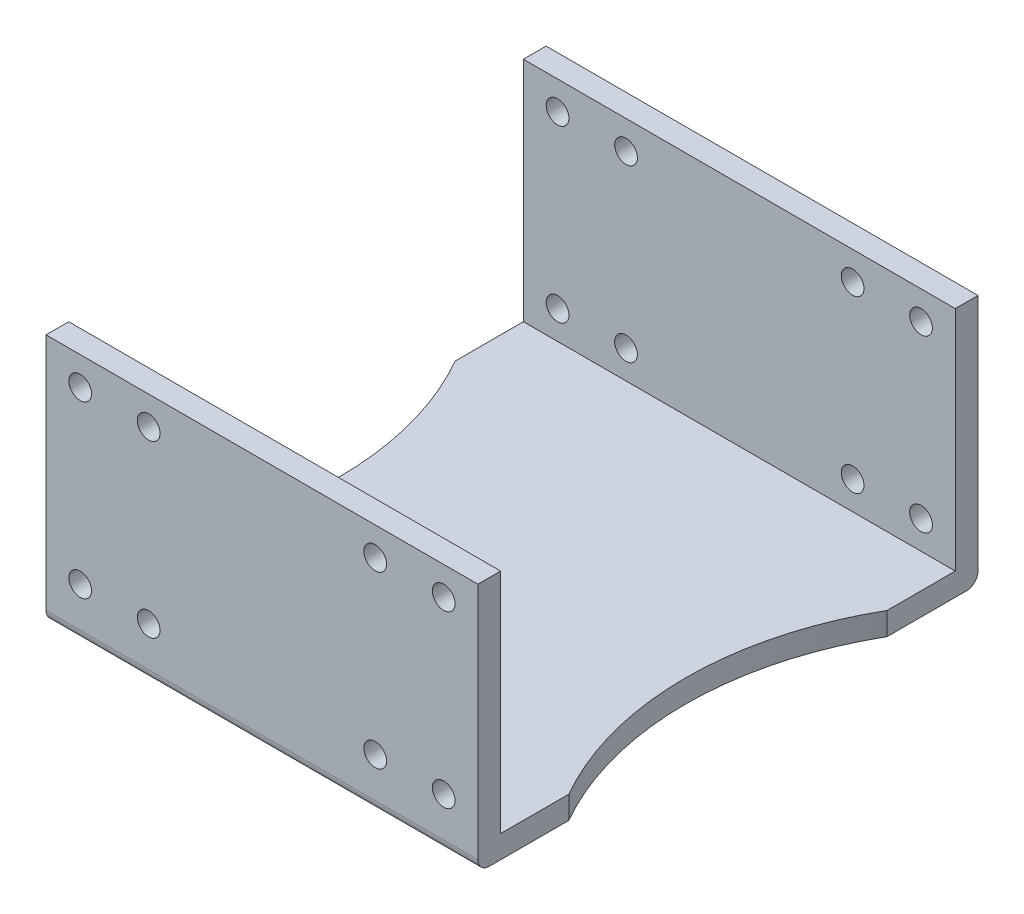
ISO-10303-21;
HEADER;
FILE_DESCRIPTION(('STEP AP214'),'2;1');
FILE_NAME('part.step','',(''),(''),'','','');
FILE_SCHEMA(('AUTOMOTIVE_DESIGN { 1 0 10303 214 1 1 1 1 }'));
ENDSEC;
DATA;
#1=APPLICATION_CONTEXT('core data for automotive mechanical design processes');
#2=APPLICATION_PROTOCOL_DEFINITION('international standard','automotive_design',2000,#1);
#3=PRODUCT_CONTEXT('',#1,'mechanical');
#4=PRODUCT('Part','Part','',(#3));
#5=PRODUCT_RELATED_PRODUCT_CATEGORY('part','',(#4));
#6=PRODUCT_DEFINITION_FORMATION('','',#4);
#7=PRODUCT_DEFINITION_CONTEXT('part definition',#1,'design');
#8=PRODUCT_DEFINITION('design','',#6,#7);
#9=PRODUCT_DEFINITION_SHAPE('','',#8);
#10=(LENGTH_UNIT() NAMED_UNIT(*) SI_UNIT(.MILLI.,.METRE.));
#11=(NAMED_UNIT(*) PLANE_ANGLE_UNIT() SI_UNIT($,.RADIAN.));
#12=(NAMED_UNIT(*) SI_UNIT($,.STERADIAN.) SOLID_ANGLE_UNIT());
#13=UNCERTAINTY_MEASURE_WITH_UNIT(LENGTH_MEASURE(1.E-05),#10,'distance_accuracy_value','');
#14=(GEOMETRIC_REPRESENTATION_CONTEXT(3) GLOBAL_UNCERTAINTY_ASSIGNED_CONTEXT((#13)) GLOBAL_UNIT_ASSIGNED_CONTEXT((#10,
#11,#12)) REPRESENTATION_CONTEXT('',''));
#15=CARTESIAN_POINT('',(0.,0.,0.));
#16=DIRECTION('',(0.,0.,1.));
#17=DIRECTION('',(1.,0.,0.));
#18=AXIS2_PLACEMENT_3D('',#15,#16,#17);
#19=CARTESIAN_POINT('',(38.,0.,22.));
#20=DIRECTION('',(0.,1.,0.));
#21=DIRECTION('',(0.,0.,1.));
#22=AXIS2_PLACEMENT_3D('',#19,#20,#21);
#23=PLANE('',#22);
#24=DIRECTION('',(0.,0.,-1.));
#25=VECTOR('',#24,1.);
#26=CARTESIAN_POINT('',(0.,0.,22.));
#27=LINE('',#26,#25);
#28=CARTESIAN_POINT('',(0.,0.,-14.));
#29=VERTEX_POINT('',#28);
#30=CARTESIAN_POINT('',(0.,0.,-21.));
#31=VERTEX_POINT('',#30);
#32=EDGE_CURVE('E229',#29,#31,#27,.T.);
#33=ORIENTED_EDGE('',*,*,#32,.T.);
#34=DIRECTION('',(-1.,0.,0.));
#35=VECTOR('',#34,1.);
#36=CARTESIAN_POINT('',(38.,0.,-21.));
#37=LINE('',#36,#35);
#38=CARTESIAN_POINT('',(38.,0.,-21.));
#39=VERTEX_POINT('',#38);
#40=EDGE_CURVE('E201',#31,#39,#37,.F.);
#41=ORIENTED_EDGE('',*,*,#40,.T.);
#42=DIRECTION('',(0.,0.,-1.));
#43=VECTOR('',#42,1.);
#44=CARTESIAN_POINT('',(38.,0.,22.));
#45=LINE('',#44,#43);
#46=CARTESIAN_POINT('',(38.,0.,-14.));
#47=VERTEX_POINT('',#46);
#48=EDGE_CURVE('E171',#47,#39,#45,.T.);
#49=ORIENTED_EDGE('',*,*,#48,.F.);
#50=CARTESIAN_POINT('',(62.4170178710349,0.,0.));
#51=DIRECTION('',(0.,1.,0.));
#52=DIRECTION('',(0.,0.,1.));
#53=AXIS2_PLACEMENT_3D('',#50,#51,#52);
#54=CIRCLE('',#53,28.1458835660641);
#55=CARTESIAN_POINT('',(38.,0.,14.));
#56=VERTEX_POINT('',#55);
#57=EDGE_CURVE('E234',#47,#56,#54,.T.);
#58=ORIENTED_EDGE('',*,*,#57,.T.);
#59=CARTESIAN_POINT('',(38.,0.,21.));
#60=VERTEX_POINT('',#59);
#61=EDGE_CURVE('E222',#60,#56,#45,.T.);
#62=ORIENTED_EDGE('',*,*,#61,.F.);
#63=DIRECTION('',(-1.,0.,0.));
#64=VECTOR('',#63,1.);
#65=CARTESIAN_POINT('',(0.,0.,21.));
#66=LINE('',#65,#64);
#67=CARTESIAN_POINT('',(0.,0.,21.));
#68=VERTEX_POINT('',#67);
#69=EDGE_CURVE('E198',#60,#68,#66,.T.);
#70=ORIENTED_EDGE('',*,*,#69,.T.);
#71=CARTESIAN_POINT('',(0.,0.,14.));
#72=VERTEX_POINT('',#71);
#73=EDGE_CURVE('E233',#68,#72,#27,.T.);
#74=ORIENTED_EDGE('',*,*,#73,.T.);
#75=CARTESIAN_POINT('',(-24.4170178710349,0.,0.));
#76=DIRECTION('',(0.,1.,0.));
#77=DIRECTION('',(0.,0.,1.));
#78=AXIS2_PLACEMENT_3D('',#75,#76,#77);
#79=CIRCLE('',#78,28.1458835660641);
#80=EDGE_CURVE('E139',#29,#72,#79,.F.);
#81=ORIENTED_EDGE('',*,*,#80,.F.);
#82=EDGE_LOOP('',(#33,#41,#49,#58,#62,#70,#74,#81));
#83=FACE_BOUND('',#82,.T.);
#84=ADVANCED_FACE('F34',(#83),#23,.F.);
#85=CARTESIAN_POINT('',(38.,2.,-20.));
#86=DIRECTION('',(0.,-1.,0.));
#87=DIRECTION('',(0.,0.,-1.));
#88=AXIS2_PLACEMENT_3D('',#85,#86,#87);
#89=PLANE('',#88);
#90=CARTESIAN_POINT('',(-24.4170178710349,2.,0.));
#91=DIRECTION('',(0.,-1.,0.));
#92=DIRECTION('',(0.,0.,-1.));
#93=AXIS2_PLACEMENT_3D('',#90,#91,#92);
#94=CIRCLE('',#93,28.1458835660641);
#95=CARTESIAN_POINT('',(0.,2.,14.));
#96=VERTEX_POINT('',#95);
#97=CARTESIAN_POINT('',(0.,2.,-14.));
#98=VERTEX_POINT('',#97);
#99=EDGE_CURVE('E136',#96,#98,#94,.F.);
#100=ORIENTED_EDGE('',*,*,#99,.F.);
#101=DIRECTION('',(0.,0.,1.));
#102=VECTOR('',#101,1.);
#103=CARTESIAN_POINT('',(0.,2.,-20.));
#104=LINE('',#103,#102);
#105=CARTESIAN_POINT('',(0.,2.,20.));
#106=VERTEX_POINT('',#105);
#107=EDGE_CURVE('E148',#96,#106,#104,.T.);
#108=ORIENTED_EDGE('',*,*,#107,.T.);
#109=DIRECTION('',(-1.,0.,0.));
#110=VECTOR('',#109,1.);
#111=CARTESIAN_POINT('',(38.,2.,20.));
#112=LINE('',#111,#110);
#113=CARTESIAN_POINT('',(38.,2.,20.));
#114=VERTEX_POINT('',#113);
#115=EDGE_CURVE('E178',#114,#106,#112,.T.);
#116=ORIENTED_EDGE('',*,*,#115,.F.);
#117=DIRECTION('',(0.,0.,1.));
#118=VECTOR('',#117,1.);
#119=CARTESIAN_POINT('',(38.,2.,-20.));
#120=LINE('',#119,#118);
#121=CARTESIAN_POINT('',(38.,2.,14.));
#122=VERTEX_POINT('',#121);
#123=EDGE_CURVE('E253',#122,#114,#120,.T.);
#124=ORIENTED_EDGE('',*,*,#123,.F.);
#125=CARTESIAN_POINT('',(62.4170178710349,2.,0.));
#126=DIRECTION('',(0.,-1.,0.));
#127=DIRECTION('',(0.,0.,-1.));
#128=AXIS2_PLACEMENT_3D('',#125,#126,#127);
#129=CIRCLE('',#128,28.1458835660641);
#130=CARTESIAN_POINT('',(38.,2.,-14.));
#131=VERTEX_POINT('',#130);
#132=EDGE_CURVE('E237',#122,#131,#129,.T.);
#133=ORIENTED_EDGE('',*,*,#132,.T.);
#134=CARTESIAN_POINT('',(38.,2.,-20.));
#135=VERTEX_POINT('',#134);
#136=EDGE_CURVE('E255',#135,#131,#120,.T.);
#137=ORIENTED_EDGE('',*,*,#136,.F.);
#138=DIRECTION('',(-1.,0.,0.));
#139=VECTOR('',#138,1.);
#140=CARTESIAN_POINT('',(38.,2.,-20.));
#141=LINE('',#140,#139);
#142=CARTESIAN_POINT('',(0.,2.,-20.));
#143=VERTEX_POINT('',#142);
#144=EDGE_CURVE('E180',#135,#143,#141,.T.);
#145=ORIENTED_EDGE('',*,*,#144,.T.);
#146=EDGE_CURVE('E152',#143,#98,#104,.T.);
#147=ORIENTED_EDGE('',*,*,#146,.T.);
#148=EDGE_LOOP('',(#100,#108,#116,#124,#133,#137,#145,#147));
#149=FACE_BOUND('',#148,.T.);
#150=ADVANCED_FACE('F146',(#149),#89,.F.);
#151=CARTESIAN_POINT('',(38.,0.,0.));
#152=DIRECTION('',(1.,0.,0.));
#153=DIRECTION('',(0.,0.,-1.));
#154=AXIS2_PLACEMENT_3D('',#151,#152,#153);
#155=PLANE('',#154);
#156=ORIENTED_EDGE('',*,*,#48,.T.);
#157=CARTESIAN_POINT('',(38.,1.,-21.));
#158=DIRECTION('',(1.,0.,0.));
#159=DIRECTION('',(0.,0.,-1.));
#160=AXIS2_PLACEMENT_3D('',#157,#158,#159);
#161=CIRCLE('',#160,1.);
#162=CARTESIAN_POINT('',(38.,1.,-22.));
#163=VERTEX_POINT('',#162);
#164=EDGE_CURVE('E203',#39,#163,#161,.T.);
#165=ORIENTED_EDGE('',*,*,#164,.T.);
#166=DIRECTION('',(0.,1.,0.));
#167=VECTOR('',#166,1.);
#168=CARTESIAN_POINT('',(38.,0.,-22.));
#169=LINE('',#168,#167);
#170=CARTESIAN_POINT('',(38.,22.,-22.));
#171=VERTEX_POINT('',#170);
#172=EDGE_CURVE('E210',#163,#171,#169,.T.);
#173=ORIENTED_EDGE('',*,*,#172,.T.);
#174=DIRECTION('',(0.,0.,1.));
#175=VECTOR('',#174,1.);
#176=CARTESIAN_POINT('',(38.,22.,-22.));
#177=LINE('',#176,#175);
#178=CARTESIAN_POINT('',(38.,22.,-20.));
#179=VERTEX_POINT('',#178);
#180=EDGE_CURVE('E221',#171,#179,#177,.T.);
#181=ORIENTED_EDGE('',*,*,#180,.T.);
#182=DIRECTION('',(0.,-1.,0.));
#183=VECTOR('',#182,1.);
#184=CARTESIAN_POINT('',(38.,22.,-20.));
#185=LINE('',#184,#183);
#186=EDGE_CURVE('E250',#179,#135,#185,.T.);
#187=ORIENTED_EDGE('',*,*,#186,.T.);
#188=ORIENTED_EDGE('',*,*,#136,.T.);
#189=DIRECTION('',(0.,1.,0.));
#190=VECTOR('',#189,1.);
#191=CARTESIAN_POINT('',(38.,-26.,-14.));
#192=LINE('',#191,#190);
#193=EDGE_CURVE('E191',#47,#131,#192,.T.);
#194=ORIENTED_EDGE('',*,*,#193,.F.);
#195=EDGE_LOOP('',(#156,#165,#173,#181,#187,#188,#194));
#196=FACE_BOUND('',#195,.T.);
#197=ADVANCED_FACE('F209',(#196),#155,.T.);
#198=CARTESIAN_POINT('',(0.,0.,0.));
#199=DIRECTION('',(1.,0.,0.));
#200=DIRECTION('',(0.,0.,-1.));
#201=AXIS2_PLACEMENT_3D('',#198,#199,#200);
#202=PLANE('',#201);
#203=DIRECTION('',(0.,1.,0.));
#204=VECTOR('',#203,1.);
#205=CARTESIAN_POINT('',(0.,0.,-22.));
#206=LINE('',#205,#204);
#207=CARTESIAN_POINT('',(0.,1.,-22.));
#208=VERTEX_POINT('',#207);
#209=CARTESIAN_POINT('',(0.,22.,-22.));
#210=VERTEX_POINT('',#209);
#211=EDGE_CURVE('E231',#208,#210,#206,.T.);
#212=ORIENTED_EDGE('',*,*,#211,.F.);
#213=CARTESIAN_POINT('',(0.,1.,-21.));
#214=DIRECTION('',(1.,0.,0.));
#215=DIRECTION('',(0.,0.,-1.));
#216=AXIS2_PLACEMENT_3D('',#213,#214,#215);
#217=CIRCLE('',#216,1.);
#218=EDGE_CURVE('E196',#208,#31,#217,.F.);
#219=ORIENTED_EDGE('',*,*,#218,.T.);
#220=ORIENTED_EDGE('',*,*,#32,.F.);
#221=DIRECTION('',(0.,1.,0.));
#222=VECTOR('',#221,1.);
#223=CARTESIAN_POINT('',(0.,-26.,-14.));
#224=LINE('',#223,#222);
#225=EDGE_CURVE('E141',#98,#29,#224,.F.);
#226=ORIENTED_EDGE('',*,*,#225,.F.);
#227=ORIENTED_EDGE('',*,*,#146,.F.);
#228=DIRECTION('',(0.,-1.,0.));
#229=VECTOR('',#228,1.);
#230=CARTESIAN_POINT('',(0.,22.,-20.));
#231=LINE('',#230,#229);
#232=CARTESIAN_POINT('',(0.,22.,-20.));
#233=VERTEX_POINT('',#232);
#234=EDGE_CURVE('E160',#233,#143,#231,.T.);
#235=ORIENTED_EDGE('',*,*,#234,.F.);
#236=DIRECTION('',(0.,0.,1.));
#237=VECTOR('',#236,1.);
#238=CARTESIAN_POINT('',(0.,22.,-22.));
#239=LINE('',#238,#237);
#240=EDGE_CURVE('E162',#210,#233,#239,.T.);
#241=ORIENTED_EDGE('',*,*,#240,.F.);
#242=EDGE_LOOP('',(#212,#219,#220,#226,#227,#235,#241));
#243=FACE_BOUND('',#242,.T.);
#244=ADVANCED_FACE('F228',(#243),#202,.F.);
#245=ORIENTED_EDGE('',*,*,#73,.F.);
#246=CARTESIAN_POINT('',(0.,1.,21.));
#247=DIRECTION('',(1.,0.,0.));
#248=DIRECTION('',(0.,0.,-1.));
#249=AXIS2_PLACEMENT_3D('',#246,#247,#248);
#250=CIRCLE('',#249,1.);
#251=CARTESIAN_POINT('',(0.,1.,22.));
#252=VERTEX_POINT('',#251);
#253=EDGE_CURVE('E56',#68,#252,#250,.F.);
#254=ORIENTED_EDGE('',*,*,#253,.T.);
#255=DIRECTION('',(0.,1.,0.));
#256=VECTOR('',#255,1.);
#257=CARTESIAN_POINT('',(0.,0.,22.));
#258=LINE('',#257,#256);
#259=CARTESIAN_POINT('',(0.,22.,22.));
#260=VERTEX_POINT('',#259);
#261=EDGE_CURVE('E169',#252,#260,#258,.T.);
#262=ORIENTED_EDGE('',*,*,#261,.T.);
#263=DIRECTION('',(0.,0.,-1.));
#264=VECTOR('',#263,1.);
#265=CARTESIAN_POINT('',(0.,22.,22.));
#266=LINE('',#265,#264);
#267=CARTESIAN_POINT('',(0.,22.,20.));
#268=VERTEX_POINT('',#267);
#269=EDGE_CURVE('E167',#260,#268,#266,.T.);
#270=ORIENTED_EDGE('',*,*,#269,.T.);
#271=DIRECTION('',(0.,-1.,0.));
#272=VECTOR('',#271,1.);
#273=CARTESIAN_POINT('',(0.,22.,20.));
#274=LINE('',#273,#272);
#275=EDGE_CURVE('E159',#268,#106,#274,.T.);
#276=ORIENTED_EDGE('',*,*,#275,.T.);
#277=ORIENTED_EDGE('',*,*,#107,.F.);
#278=DIRECTION('',(0.,1.,0.));
#279=VECTOR('',#278,1.);
#280=CARTESIAN_POINT('',(0.,-26.,14.));
#281=LINE('',#280,#279);
#282=EDGE_CURVE('E133',#72,#96,#281,.T.);
#283=ORIENTED_EDGE('',*,*,#282,.F.);
#284=EDGE_LOOP('',(#245,#254,#262,#270,#276,#277,#283));
#285=FACE_BOUND('',#284,.T.);
#286=ADVANCED_FACE('F156',(#285),#202,.F.);
#287=CARTESIAN_POINT('',(38.,0.,-22.));
#288=DIRECTION('',(0.,0.,1.));
#289=DIRECTION('',(1.,0.,0.));
#290=AXIS2_PLACEMENT_3D('',#287,#288,#289);
#291=PLANE('',#290);
#292=CARTESIAN_POINT('',(28.9668172486929,19.5,-22.));
#293=DIRECTION('',(0.,0.,1.));
#294=DIRECTION('',(1.,0.,0.));
#295=AXIS2_PLACEMENT_3D('',#292,#293,#294);
#296=CIRCLE('',#295,1.);
#297=CARTESIAN_POINT('',(29.9668172486929,19.5,-22.));
#298=VERTEX_POINT('',#297);
#299=EDGE_CURVE('E153',#298,#298,#296,.T.);
#300=ORIENTED_EDGE('',*,*,#299,.T.);
#301=EDGE_LOOP('',(#300));
#302=FACE_BOUND('',#301,.T.);
#303=CARTESIAN_POINT('',(9.03318275130709,4.5,-22.));
#304=DIRECTION('',(0.,0.,1.));
#305=DIRECTION('',(1.,0.,0.));
#306=AXIS2_PLACEMENT_3D('',#303,#304,#305);
#307=CIRCLE('',#306,1.);
#308=CARTESIAN_POINT('',(10.0331827513071,4.5,-22.));
#309=VERTEX_POINT('',#308);
#310=EDGE_CURVE('E293',#309,#309,#307,.T.);
#311=ORIENTED_EDGE('',*,*,#310,.T.);
#312=EDGE_LOOP('',(#311));
#313=FACE_BOUND('',#312,.T.);
#314=CARTESIAN_POINT('',(3.01035142346363,4.5,-22.));
#315=DIRECTION('',(0.,0.,1.));
#316=DIRECTION('',(1.,0.,0.));
#317=AXIS2_PLACEMENT_3D('',#314,#315,#316);
#318=CIRCLE('',#317,1.);
#319=CARTESIAN_POINT('',(4.01035142346363,4.5,-22.));
#320=VERTEX_POINT('',#319);
#321=EDGE_CURVE('E302',#320,#320,#318,.T.);
#322=ORIENTED_EDGE('',*,*,#321,.T.);
#323=EDGE_LOOP('',(#322));
#324=FACE_BOUND('',#323,.T.);
#325=CARTESIAN_POINT('',(9.03318275130709,19.5,-22.));
#326=DIRECTION('',(0.,0.,1.));
#327=DIRECTION('',(1.,0.,0.));
#328=AXIS2_PLACEMENT_3D('',#325,#326,#327);
#329=CIRCLE('',#328,1.);
#330=CARTESIAN_POINT('',(10.0331827513071,19.5,-22.));
#331=VERTEX_POINT('',#330);
#332=EDGE_CURVE('E311',#331,#331,#329,.T.);
#333=ORIENTED_EDGE('',*,*,#332,.T.);
#334=EDGE_LOOP('',(#333));
#335=FACE_BOUND('',#334,.T.);
#336=CARTESIAN_POINT('',(34.9896485765364,19.5,-22.));
#337=DIRECTION('',(0.,0.,1.));
#338=DIRECTION('',(1.,0.,0.));
#339=AXIS2_PLACEMENT_3D('',#336,#337,#338);
#340=CIRCLE('',#339,1.00000000000001);
#341=CARTESIAN_POINT('',(35.9896485765364,19.5,-22.));
#342=VERTEX_POINT('',#341);
#343=EDGE_CURVE('E320',#342,#342,#340,.T.);
#344=ORIENTED_EDGE('',*,*,#343,.T.);
#345=EDGE_LOOP('',(#344));
#346=FACE_BOUND('',#345,.T.);
#347=CARTESIAN_POINT('',(34.9896485765364,4.5,-22.));
#348=DIRECTION('',(0.,0.,1.));
#349=DIRECTION('',(1.,0.,0.));
#350=AXIS2_PLACEMENT_3D('',#347,#348,#349);
#351=CIRCLE('',#350,1.00000000000001);
#352=CARTESIAN_POINT('',(35.9896485765364,4.5,-22.));
#353=VERTEX_POINT('',#352);
#354=EDGE_CURVE('E329',#353,#353,#351,.T.);
#355=ORIENTED_EDGE('',*,*,#354,.T.);
#356=EDGE_LOOP('',(#355));
#357=FACE_BOUND('',#356,.T.);
#358=CARTESIAN_POINT('',(28.9668172486929,4.5,-22.));
#359=DIRECTION('',(0.,0.,1.));
#360=DIRECTION('',(1.,0.,0.));
#361=AXIS2_PLACEMENT_3D('',#358,#359,#360);
#362=CIRCLE('',#361,1.);
#363=CARTESIAN_POINT('',(29.9668172486929,4.5,-22.));
#364=VERTEX_POINT('',#363);
#365=EDGE_CURVE('E338',#364,#364,#362,.T.);
#366=ORIENTED_EDGE('',*,*,#365,.T.);
#367=EDGE_LOOP('',(#366));
#368=FACE_BOUND('',#367,.T.);
#369=CARTESIAN_POINT('',(3.01035142346363,19.5,-22.));
#370=DIRECTION('',(0.,0.,1.));
#371=DIRECTION('',(1.,0.,0.));
#372=AXIS2_PLACEMENT_3D('',#369,#370,#371);
#373=CIRCLE('',#372,1.);
#374=CARTESIAN_POINT('',(4.01035142346363,19.5,-22.));
#375=VERTEX_POINT('',#374);
#376=EDGE_CURVE('E347',#375,#375,#373,.T.);
#377=ORIENTED_EDGE('',*,*,#376,.T.);
#378=EDGE_LOOP('',(#377));
#379=FACE_BOUND('',#378,.T.);
#380=ORIENTED_EDGE('',*,*,#172,.F.);
#381=DIRECTION('',(-1.,0.,0.));
#382=VECTOR('',#381,1.);
#383=CARTESIAN_POINT('',(38.,1.,-22.));
#384=LINE('',#383,#382);
#385=EDGE_CURVE('E193',#163,#208,#384,.T.);
#386=ORIENTED_EDGE('',*,*,#385,.T.);
#387=ORIENTED_EDGE('',*,*,#211,.T.);
#388=DIRECTION('',(-1.,0.,0.));
#389=VECTOR('',#388,1.);
#390=CARTESIAN_POINT('',(38.,22.,-22.));
#391=LINE('',#390,#389);
#392=EDGE_CURVE('E142',#171,#210,#391,.T.);
#393=ORIENTED_EDGE('',*,*,#392,.F.);
#394=EDGE_LOOP('',(#380,#386,#387,#393));
#395=FACE_BOUND('',#394,.T.);
#396=ADVANCED_FACE('F218',(#302,#313,#324,#335,#346,#357,#368,#379,#395),#291,.F.);
#397=CARTESIAN_POINT('',(38.,22.,-22.));
#398=DIRECTION('',(0.,-1.,0.));
#399=DIRECTION('',(0.,0.,-1.));
#400=AXIS2_PLACEMENT_3D('',#397,#398,#399);
#401=PLANE('',#400);
#402=ORIENTED_EDGE('',*,*,#240,.T.);
#403=DIRECTION('',(-1.,0.,0.));
#404=VECTOR('',#403,1.);
#405=CARTESIAN_POINT('',(38.,22.,-20.));
#406=LINE('',#405,#404);
#407=EDGE_CURVE('E182',#179,#233,#406,.T.);
#408=ORIENTED_EDGE('',*,*,#407,.F.);
#409=ORIENTED_EDGE('',*,*,#180,.F.);
#410=ORIENTED_EDGE('',*,*,#392,.T.);
#411=EDGE_LOOP('',(#402,#408,#409,#410));
#412=FACE_BOUND('',#411,.T.);
#413=ADVANCED_FACE('F244',(#412),#401,.F.);
#414=CARTESIAN_POINT('',(38.,22.,-20.));
#415=DIRECTION('',(0.,0.,-1.));
#416=DIRECTION('',(0.,1.,0.));
#417=AXIS2_PLACEMENT_3D('',#414,#415,#416);
#418=PLANE('',#417);
#419=CARTESIAN_POINT('',(28.9668172486929,19.5,-20.));
#420=DIRECTION('',(0.,0.,-1.));
#421=DIRECTION('',(0.,1.,0.));
#422=AXIS2_PLACEMENT_3D('',#419,#420,#421);
#423=CIRCLE('',#422,1.);
#424=CARTESIAN_POINT('',(28.9668172486929,20.5,-20.));
#425=VERTEX_POINT('',#424);
#426=EDGE_CURVE('E287',#425,#425,#423,.T.);
#427=ORIENTED_EDGE('',*,*,#426,.T.);
#428=EDGE_LOOP('',(#427));
#429=FACE_BOUND('',#428,.T.);
#430=CARTESIAN_POINT('',(9.03318275130709,4.5,-20.));
#431=DIRECTION('',(0.,0.,-1.));
#432=DIRECTION('',(0.,1.,0.));
#433=AXIS2_PLACEMENT_3D('',#430,#431,#432);
#434=CIRCLE('',#433,1.);
#435=CARTESIAN_POINT('',(9.03318275130709,5.5,-20.));
#436=VERTEX_POINT('',#435);
#437=EDGE_CURVE('E296',#436,#436,#434,.T.);
#438=ORIENTED_EDGE('',*,*,#437,.T.);
#439=EDGE_LOOP('',(#438));
#440=FACE_BOUND('',#439,.T.);
#441=CARTESIAN_POINT('',(3.01035142346363,4.5,-20.));
#442=DIRECTION('',(0.,0.,-1.));
#443=DIRECTION('',(0.,1.,0.));
#444=AXIS2_PLACEMENT_3D('',#441,#442,#443);
#445=CIRCLE('',#444,1.);
#446=CARTESIAN_POINT('',(3.01035142346363,5.5,-20.));
#447=VERTEX_POINT('',#446);
#448=EDGE_CURVE('E305',#447,#447,#445,.T.);
#449=ORIENTED_EDGE('',*,*,#448,.T.);
#450=EDGE_LOOP('',(#449));
#451=FACE_BOUND('',#450,.T.);
#452=CARTESIAN_POINT('',(9.03318275130709,19.5,-20.));
#453=DIRECTION('',(0.,0.,-1.));
#454=DIRECTION('',(0.,1.,0.));
#455=AXIS2_PLACEMENT_3D('',#452,#453,#454);
#456=CIRCLE('',#455,1.);
#457=CARTESIAN_POINT('',(9.03318275130709,20.5,-20.));
#458=VERTEX_POINT('',#457);
#459=EDGE_CURVE('E314',#458,#458,#456,.T.);
#460=ORIENTED_EDGE('',*,*,#459,.T.);
#461=EDGE_LOOP('',(#460));
#462=FACE_BOUND('',#461,.T.);
#463=CARTESIAN_POINT('',(34.9896485765364,19.5,-20.));
#464=DIRECTION('',(0.,0.,-1.));
#465=DIRECTION('',(0.,1.,0.));
#466=AXIS2_PLACEMENT_3D('',#463,#464,#465);
#467=CIRCLE('',#466,1.00000000000001);
#468=CARTESIAN_POINT('',(34.9896485765364,20.5,-20.));
#469=VERTEX_POINT('',#468);
#470=EDGE_CURVE('E323',#469,#469,#467,.T.);
#471=ORIENTED_EDGE('',*,*,#470,.T.);
#472=EDGE_LOOP('',(#471));
#473=FACE_BOUND('',#472,.T.);
#474=CARTESIAN_POINT('',(34.9896485765364,4.5,-20.));
#475=DIRECTION('',(0.,0.,-1.));
#476=DIRECTION('',(0.,1.,0.));
#477=AXIS2_PLACEMENT_3D('',#474,#475,#476);
#478=CIRCLE('',#477,1.00000000000001);
#479=CARTESIAN_POINT('',(34.9896485765364,5.50000000000001,-20.));
#480=VERTEX_POINT('',#479);
#481=EDGE_CURVE('E332',#480,#480,#478,.T.);
#482=ORIENTED_EDGE('',*,*,#481,.T.);
#483=EDGE_LOOP('',(#482));
#484=FACE_BOUND('',#483,.T.);
#485=CARTESIAN_POINT('',(28.9668172486929,4.5,-20.));
#486=DIRECTION('',(0.,0.,-1.));
#487=DIRECTION('',(0.,1.,0.));
#488=AXIS2_PLACEMENT_3D('',#485,#486,#487);
#489=CIRCLE('',#488,1.);
#490=CARTESIAN_POINT('',(28.9668172486929,5.5,-20.));
#491=VERTEX_POINT('',#490);
#492=EDGE_CURVE('E341',#491,#491,#489,.T.);
#493=ORIENTED_EDGE('',*,*,#492,.T.);
#494=EDGE_LOOP('',(#493));
#495=FACE_BOUND('',#494,.T.);
#496=CARTESIAN_POINT('',(3.01035142346363,19.5,-20.));
#497=DIRECTION('',(0.,0.,-1.));
#498=DIRECTION('',(0.,1.,0.));
#499=AXIS2_PLACEMENT_3D('',#496,#497,#498);
#500=CIRCLE('',#499,1.);
#501=CARTESIAN_POINT('',(3.01035142346363,20.5,-20.));
#502=VERTEX_POINT('',#501);
#503=EDGE_CURVE('E350',#502,#502,#500,.T.);
#504=ORIENTED_EDGE('',*,*,#503,.T.);
#505=EDGE_LOOP('',(#504));
#506=FACE_BOUND('',#505,.T.);
#507=ORIENTED_EDGE('',*,*,#234,.T.);
#508=ORIENTED_EDGE('',*,*,#144,.F.);
#509=ORIENTED_EDGE('',*,*,#186,.F.);
#510=ORIENTED_EDGE('',*,*,#407,.T.);
#511=EDGE_LOOP('',(#507,#508,#509,#510));
#512=FACE_BOUND('',#511,.T.);
#513=ADVANCED_FACE('F248',(#429,#440,#451,#462,#473,#484,#495,#506,#512),#418,.F.);
#514=CARTESIAN_POINT('',(38.,22.,20.));
#515=DIRECTION('',(0.,0.,-1.));
#516=DIRECTION('',(0.,1.,0.));
#517=AXIS2_PLACEMENT_3D('',#514,#515,#516);
#518=PLANE('',#517);
#519=CARTESIAN_POINT('',(28.9668172486929,19.5,20.));
#520=DIRECTION('',(0.,0.,-1.));
#521=DIRECTION('',(0.,1.,0.));
#522=AXIS2_PLACEMENT_3D('',#519,#520,#521);
#523=CIRCLE('',#522,1.);
#524=CARTESIAN_POINT('',(28.9668172486929,20.5,20.));
#525=VERTEX_POINT('',#524);
#526=EDGE_CURVE('E290',#525,#525,#523,.T.);
#527=ORIENTED_EDGE('',*,*,#526,.F.);
#528=EDGE_LOOP('',(#527));
#529=FACE_BOUND('',#528,.T.);
#530=CARTESIAN_POINT('',(9.03318275130709,4.5,20.));
#531=DIRECTION('',(0.,0.,-1.));
#532=DIRECTION('',(0.,1.,0.));
#533=AXIS2_PLACEMENT_3D('',#530,#531,#532);
#534=CIRCLE('',#533,1.);
#535=CARTESIAN_POINT('',(9.03318275130709,5.5,20.));
#536=VERTEX_POINT('',#535);
#537=EDGE_CURVE('E299',#536,#536,#534,.T.);
#538=ORIENTED_EDGE('',*,*,#537,.F.);
#539=EDGE_LOOP('',(#538));
#540=FACE_BOUND('',#539,.T.);
#541=CARTESIAN_POINT('',(3.01035142346363,4.5,20.));
#542=DIRECTION('',(0.,0.,-1.));
#543=DIRECTION('',(0.,1.,0.));
#544=AXIS2_PLACEMENT_3D('',#541,#542,#543);
#545=CIRCLE('',#544,1.);
#546=CARTESIAN_POINT('',(3.01035142346363,5.5,20.));
#547=VERTEX_POINT('',#546);
#548=EDGE_CURVE('E308',#547,#547,#545,.T.);
#549=ORIENTED_EDGE('',*,*,#548,.F.);
#550=EDGE_LOOP('',(#549));
#551=FACE_BOUND('',#550,.T.);
#552=CARTESIAN_POINT('',(9.03318275130709,19.5,20.));
#553=DIRECTION('',(0.,0.,-1.));
#554=DIRECTION('',(0.,1.,0.));
#555=AXIS2_PLACEMENT_3D('',#552,#553,#554);
#556=CIRCLE('',#555,1.);
#557=CARTESIAN_POINT('',(9.03318275130709,20.5,20.));
#558=VERTEX_POINT('',#557);
#559=EDGE_CURVE('E317',#558,#558,#556,.T.);
#560=ORIENTED_EDGE('',*,*,#559,.F.);
#561=EDGE_LOOP('',(#560));
#562=FACE_BOUND('',#561,.T.);
#563=CARTESIAN_POINT('',(34.9896485765364,19.5,20.));
#564=DIRECTION('',(0.,0.,-1.));
#565=DIRECTION('',(0.,1.,0.));
#566=AXIS2_PLACEMENT_3D('',#563,#564,#565);
#567=CIRCLE('',#566,1.00000000000001);
#568=CARTESIAN_POINT('',(34.9896485765364,20.5,20.));
#569=VERTEX_POINT('',#568);
#570=EDGE_CURVE('E326',#569,#569,#567,.T.);
#571=ORIENTED_EDGE('',*,*,#570,.F.);
#572=EDGE_LOOP('',(#571));
#573=FACE_BOUND('',#572,.T.);
#574=CARTESIAN_POINT('',(34.9896485765364,4.5,20.));
#575=DIRECTION('',(0.,0.,-1.));
#576=DIRECTION('',(0.,1.,0.));
#577=AXIS2_PLACEMENT_3D('',#574,#575,#576);
#578=CIRCLE('',#577,1.00000000000001);
#579=CARTESIAN_POINT('',(34.9896485765364,5.50000000000001,20.));
#580=VERTEX_POINT('',#579);
#581=EDGE_CURVE('E335',#580,#580,#578,.T.);
#582=ORIENTED_EDGE('',*,*,#581,.F.);
#583=EDGE_LOOP('',(#582));
#584=FACE_BOUND('',#583,.T.);
#585=CARTESIAN_POINT('',(28.9668172486929,4.5,20.));
#586=DIRECTION('',(0.,0.,-1.));
#587=DIRECTION('',(0.,1.,0.));
#588=AXIS2_PLACEMENT_3D('',#585,#586,#587);
#589=CIRCLE('',#588,1.);
#590=CARTESIAN_POINT('',(28.9668172486929,5.5,20.));
#591=VERTEX_POINT('',#590);
#592=EDGE_CURVE('E344',#591,#591,#589,.T.);
#593=ORIENTED_EDGE('',*,*,#592,.F.);
#594=EDGE_LOOP('',(#593));
#595=FACE_BOUND('',#594,.T.);
#596=CARTESIAN_POINT('',(3.01035142346363,19.5,20.));
#597=DIRECTION('',(0.,0.,-1.));
#598=DIRECTION('',(0.,1.,0.));
#599=AXIS2_PLACEMENT_3D('',#596,#597,#598);
#600=CIRCLE('',#599,1.);
#601=CARTESIAN_POINT('',(3.01035142346363,20.5,20.));
#602=VERTEX_POINT('',#601);
#603=EDGE_CURVE('E353',#602,#602,#600,.T.);
#604=ORIENTED_EDGE('',*,*,#603,.F.);
#605=EDGE_LOOP('',(#604));
#606=FACE_BOUND('',#605,.T.);
#607=ORIENTED_EDGE('',*,*,#275,.F.);
#608=DIRECTION('',(-1.,0.,0.));
#609=VECTOR('',#608,1.);
#610=CARTESIAN_POINT('',(38.,22.,20.));
#611=LINE('',#610,#609);
#612=CARTESIAN_POINT('',(38.,22.,20.));
#613=VERTEX_POINT('',#612);
#614=EDGE_CURVE('E175',#613,#268,#611,.T.);
#615=ORIENTED_EDGE('',*,*,#614,.F.);
#616=DIRECTION('',(0.,-1.,0.));
#617=VECTOR('',#616,1.);
#618=CARTESIAN_POINT('',(38.,22.,20.));
#619=LINE('',#618,#617);
#620=EDGE_CURVE('E259',#613,#114,#619,.T.);
#621=ORIENTED_EDGE('',*,*,#620,.T.);
#622=ORIENTED_EDGE('',*,*,#115,.T.);
#623=EDGE_LOOP('',(#607,#615,#621,#622));
#624=FACE_BOUND('',#623,.T.);
#625=ADVANCED_FACE('F276',(#529,#540,#551,#562,#573,#584,#595,#606,#624),#518,.T.);
#626=CARTESIAN_POINT('',(38.,22.,22.));
#627=DIRECTION('',(0.,1.,0.));
#628=DIRECTION('',(0.,0.,1.));
#629=AXIS2_PLACEMENT_3D('',#626,#627,#628);
#630=PLANE('',#629);
#631=ORIENTED_EDGE('',*,*,#269,.F.);
#632=DIRECTION('',(-1.,0.,0.));
#633=VECTOR('',#632,1.);
#634=CARTESIAN_POINT('',(38.,22.,22.));
#635=LINE('',#634,#633);
#636=CARTESIAN_POINT('',(38.,22.,22.));
#637=VERTEX_POINT('',#636);
#638=EDGE_CURVE('E172',#637,#260,#635,.T.);
#639=ORIENTED_EDGE('',*,*,#638,.F.);
#640=DIRECTION('',(0.,0.,-1.));
#641=VECTOR('',#640,1.);
#642=CARTESIAN_POINT('',(38.,22.,22.));
#643=LINE('',#642,#641);
#644=EDGE_CURVE('E261',#637,#613,#643,.T.);
#645=ORIENTED_EDGE('',*,*,#644,.T.);
#646=ORIENTED_EDGE('',*,*,#614,.T.);
#647=EDGE_LOOP('',(#631,#639,#645,#646));
#648=FACE_BOUND('',#647,.T.);
#649=ADVANCED_FACE('F270',(#648),#630,.T.);
#650=CARTESIAN_POINT('',(38.,0.,22.));
#651=DIRECTION('',(0.,0.,1.));
#652=DIRECTION('',(1.,0.,0.));
#653=AXIS2_PLACEMENT_3D('',#650,#651,#652);
#654=PLANE('',#653);
#655=CARTESIAN_POINT('',(28.9668172486929,19.5,22.));
#656=DIRECTION('',(0.,0.,1.));
#657=DIRECTION('',(-1.,0.,0.));
#658=AXIS2_PLACEMENT_3D('',#655,#656,#657);
#659=CIRCLE('',#658,1.);
#660=CARTESIAN_POINT('',(27.9668172486929,19.5,22.));
#661=VERTEX_POINT('',#660);
#662=EDGE_CURVE('E366',#661,#661,#659,.T.);
#663=ORIENTED_EDGE('',*,*,#662,.F.);
#664=EDGE_LOOP('',(#663));
#665=FACE_BOUND('',#664,.T.);
#666=CARTESIAN_POINT('',(9.03318275130709,4.5,22.));
#667=DIRECTION('',(0.,0.,1.));
#668=DIRECTION('',(-1.,0.,0.));
#669=AXIS2_PLACEMENT_3D('',#666,#667,#668);
#670=CIRCLE('',#669,1.);
#671=CARTESIAN_POINT('',(8.03318275130709,4.5,22.));
#672=VERTEX_POINT('',#671);
#673=EDGE_CURVE('E363',#672,#672,#670,.T.);
#674=ORIENTED_EDGE('',*,*,#673,.F.);
#675=EDGE_LOOP('',(#674));
#676=FACE_BOUND('',#675,.T.);
#677=CARTESIAN_POINT('',(3.01035142346363,4.5,22.));
#678=DIRECTION('',(0.,0.,1.));
#679=DIRECTION('',(-1.,0.,0.));
#680=AXIS2_PLACEMENT_3D('',#677,#678,#679);
#681=CIRCLE('',#680,1.);
#682=CARTESIAN_POINT('',(2.01035142346363,4.5,22.));
#683=VERTEX_POINT('',#682);
#684=EDGE_CURVE('E360',#683,#683,#681,.T.);
#685=ORIENTED_EDGE('',*,*,#684,.F.);
#686=EDGE_LOOP('',(#685));
#687=FACE_BOUND('',#686,.T.);
#688=CARTESIAN_POINT('',(9.03318275130709,19.5,22.));
#689=DIRECTION('',(0.,0.,1.));
#690=DIRECTION('',(1.,0.,0.));
#691=AXIS2_PLACEMENT_3D('',#688,#689,#690);
#692=CIRCLE('',#691,1.);
#693=CARTESIAN_POINT('',(10.0331827513071,19.5,22.));
#694=VERTEX_POINT('',#693);
#695=EDGE_CURVE('E359',#694,#694,#692,.T.);
#696=ORIENTED_EDGE('',*,*,#695,.F.);
#697=EDGE_LOOP('',(#696));
#698=FACE_BOUND('',#697,.T.);
#699=CARTESIAN_POINT('',(34.9896485765364,19.5,22.));
#700=DIRECTION('',(0.,0.,1.));
#701=DIRECTION('',(-1.,0.,0.));
#702=AXIS2_PLACEMENT_3D('',#699,#700,#701);
#703=CIRCLE('',#702,1.00000000000001);
#704=CARTESIAN_POINT('',(33.9896485765364,19.5,22.));
#705=VERTEX_POINT('',#704);
#706=EDGE_CURVE('E369',#705,#705,#703,.T.);
#707=ORIENTED_EDGE('',*,*,#706,.F.);
#708=EDGE_LOOP('',(#707));
#709=FACE_BOUND('',#708,.T.);
#710=CARTESIAN_POINT('',(34.9896485765364,4.5,22.));
#711=DIRECTION('',(0.,0.,1.));
#712=DIRECTION('',(1.,0.,0.));
#713=AXIS2_PLACEMENT_3D('',#710,#711,#712);
#714=CIRCLE('',#713,1.00000000000001);
#715=CARTESIAN_POINT('',(35.9896485765364,4.5,22.));
#716=VERTEX_POINT('',#715);
#717=EDGE_CURVE('E375',#716,#716,#714,.T.);
#718=ORIENTED_EDGE('',*,*,#717,.F.);
#719=EDGE_LOOP('',(#718));
#720=FACE_BOUND('',#719,.T.);
#721=CARTESIAN_POINT('',(28.9668172486929,4.5,22.));
#722=DIRECTION('',(0.,0.,1.));
#723=DIRECTION('',(1.,0.,0.));
#724=AXIS2_PLACEMENT_3D('',#721,#722,#723);
#725=CIRCLE('',#724,1.);
#726=CARTESIAN_POINT('',(29.9668172486929,4.5,22.));
#727=VERTEX_POINT('',#726);
#728=EDGE_CURVE('E372',#727,#727,#725,.T.);
#729=ORIENTED_EDGE('',*,*,#728,.F.);
#730=EDGE_LOOP('',(#729));
#731=FACE_BOUND('',#730,.T.);
#732=CARTESIAN_POINT('',(3.01035142346363,19.5,22.));
#733=DIRECTION('',(0.,0.,1.));
#734=DIRECTION('',(1.,0.,0.));
#735=AXIS2_PLACEMENT_3D('',#732,#733,#734);
#736=CIRCLE('',#735,1.);
#737=CARTESIAN_POINT('',(4.01035142346363,19.5,22.));
#738=VERTEX_POINT('',#737);
#739=EDGE_CURVE('E356',#738,#738,#736,.T.);
#740=ORIENTED_EDGE('',*,*,#739,.F.);
#741=EDGE_LOOP('',(#740));
#742=FACE_BOUND('',#741,.T.);
#743=ORIENTED_EDGE('',*,*,#261,.F.);
#744=DIRECTION('',(-1.,0.,0.));
#745=VECTOR('',#744,1.);
#746=CARTESIAN_POINT('',(38.,1.,22.));
#747=LINE('',#746,#745);
#748=CARTESIAN_POINT('',(38.,1.,22.));
#749=VERTEX_POINT('',#748);
#750=EDGE_CURVE('E42',#252,#749,#747,.F.);
#751=ORIENTED_EDGE('',*,*,#750,.T.);
#752=DIRECTION('',(0.,1.,0.));
#753=VECTOR('',#752,1.);
#754=CARTESIAN_POINT('',(38.,0.,22.));
#755=LINE('',#754,#753);
#756=EDGE_CURVE('E176',#749,#637,#755,.T.);
#757=ORIENTED_EDGE('',*,*,#756,.T.);
#758=ORIENTED_EDGE('',*,*,#638,.T.);
#759=EDGE_LOOP('',(#743,#751,#757,#758));
#760=FACE_BOUND('',#759,.T.);
#761=ADVANCED_FACE('F266',(#665,#676,#687,#698,#709,#720,#731,#742,#760),#654,.T.);
#762=ORIENTED_EDGE('',*,*,#756,.F.);
#763=CARTESIAN_POINT('',(38.,1.,21.));
#764=DIRECTION('',(1.,0.,0.));
#765=DIRECTION('',(0.,0.,-1.));
#766=AXIS2_PLACEMENT_3D('',#763,#764,#765);
#767=CIRCLE('',#766,1.);
#768=EDGE_CURVE('E11',#749,#60,#767,.T.);
#769=ORIENTED_EDGE('',*,*,#768,.T.);
#770=ORIENTED_EDGE('',*,*,#61,.T.);
#771=DIRECTION('',(0.,1.,0.));
#772=VECTOR('',#771,1.);
#773=CARTESIAN_POINT('',(38.,-26.,14.));
#774=LINE('',#773,#772);
#775=EDGE_CURVE('E188',#122,#56,#774,.F.);
#776=ORIENTED_EDGE('',*,*,#775,.F.);
#777=ORIENTED_EDGE('',*,*,#123,.T.);
#778=ORIENTED_EDGE('',*,*,#620,.F.);
#779=ORIENTED_EDGE('',*,*,#644,.F.);
#780=EDGE_LOOP('',(#762,#769,#770,#776,#777,#778,#779));
#781=FACE_BOUND('',#780,.T.);
#782=ADVANCED_FACE('F272',(#781),#155,.T.);
#783=CARTESIAN_POINT('',(-24.4170178710349,-26.,0.));
#784=DIRECTION('',(0.,1.,0.));
#785=DIRECTION('',(0.,0.,1.));
#786=AXIS2_PLACEMENT_3D('',#783,#784,#785);
#787=CYLINDRICAL_SURFACE('',#786,28.1458835660641);
#788=ORIENTED_EDGE('',*,*,#80,.T.);
#789=ORIENTED_EDGE('',*,*,#282,.T.);
#790=ORIENTED_EDGE('',*,*,#99,.T.);
#791=ORIENTED_EDGE('',*,*,#225,.T.);
#792=EDGE_LOOP('',(#788,#789,#790,#791));
#793=FACE_BOUND('',#792,.T.);
#794=ADVANCED_FACE('F135',(#793),#787,.F.);
#795=CARTESIAN_POINT('',(62.4170178710349,-26.,0.));
#796=DIRECTION('',(0.,1.,0.));
#797=DIRECTION('',(0.,0.,1.));
#798=AXIS2_PLACEMENT_3D('',#795,#796,#797);
#799=CYLINDRICAL_SURFACE('',#798,28.1458835660641);
#800=ORIENTED_EDGE('',*,*,#193,.T.);
#801=ORIENTED_EDGE('',*,*,#132,.F.);
#802=ORIENTED_EDGE('',*,*,#775,.T.);
#803=ORIENTED_EDGE('',*,*,#57,.F.);
#804=EDGE_LOOP('',(#800,#801,#802,#803));
#805=FACE_BOUND('',#804,.T.);
#806=ADVANCED_FACE('F396',(#805),#799,.F.);
#807=CARTESIAN_POINT('',(3.01035142346363,19.5,-46.));
#808=DIRECTION('',(0.,0.,1.));
#809=DIRECTION('',(1.,0.,0.));
#810=AXIS2_PLACEMENT_3D('',#807,#808,#809);
#811=CYLINDRICAL_SURFACE('',#810,1.);
#812=ORIENTED_EDGE('',*,*,#603,.T.);
#813=EDGE_LOOP('',(#812));
#814=FACE_BOUND('',#813,.T.);
#815=ORIENTED_EDGE('',*,*,#739,.T.);
#816=EDGE_LOOP('',(#815));
#817=FACE_BOUND('',#816,.T.);
#818=ADVANCED_FACE('F393',(#814,#817),#811,.F.);
#819=CARTESIAN_POINT('',(28.9668172486929,4.5,-46.));
#820=DIRECTION('',(0.,0.,1.));
#821=DIRECTION('',(1.,0.,0.));
#822=AXIS2_PLACEMENT_3D('',#819,#820,#821);
#823=CYLINDRICAL_SURFACE('',#822,1.);
#824=ORIENTED_EDGE('',*,*,#592,.T.);
#825=EDGE_LOOP('',(#824));
#826=FACE_BOUND('',#825,.T.);
#827=ORIENTED_EDGE('',*,*,#728,.T.);
#828=EDGE_LOOP('',(#827));
#829=FACE_BOUND('',#828,.T.);
#830=ADVANCED_FACE('F395',(#826,#829),#823,.F.);
#831=CARTESIAN_POINT('',(34.9896485765364,4.5,-46.));
#832=DIRECTION('',(0.,0.,1.));
#833=DIRECTION('',(1.,0.,0.));
#834=AXIS2_PLACEMENT_3D('',#831,#832,#833);
#835=CYLINDRICAL_SURFACE('',#834,1.00000000000001);
#836=ORIENTED_EDGE('',*,*,#581,.T.);
#837=EDGE_LOOP('',(#836));
#838=FACE_BOUND('',#837,.T.);
#839=ORIENTED_EDGE('',*,*,#717,.T.);
#840=EDGE_LOOP('',(#839));
#841=FACE_BOUND('',#840,.T.);
#842=ADVANCED_FACE('F404',(#838,#841),#835,.F.);
#843=CARTESIAN_POINT('',(34.9896485765364,19.5,-46.));
#844=DIRECTION('',(0.,0.,1.));
#845=DIRECTION('',(1.,0.,0.));
#846=AXIS2_PLACEMENT_3D('',#843,#844,#845);
#847=CYLINDRICAL_SURFACE('',#846,1.00000000000001);
#848=ORIENTED_EDGE('',*,*,#570,.T.);
#849=EDGE_LOOP('',(#848));
#850=FACE_BOUND('',#849,.T.);
#851=ORIENTED_EDGE('',*,*,#706,.T.);
#852=EDGE_LOOP('',(#851));
#853=FACE_BOUND('',#852,.T.);
#854=ADVANCED_FACE('F381',(#850,#853),#847,.F.);
#855=CARTESIAN_POINT('',(9.03318275130709,19.5,-46.));
#856=DIRECTION('',(0.,0.,1.));
#857=DIRECTION('',(1.,0.,0.));
#858=AXIS2_PLACEMENT_3D('',#855,#856,#857);
#859=CYLINDRICAL_SURFACE('',#858,1.);
#860=ORIENTED_EDGE('',*,*,#559,.T.);
#861=EDGE_LOOP('',(#860));
#862=FACE_BOUND('',#861,.T.);
#863=ORIENTED_EDGE('',*,*,#695,.T.);
#864=EDGE_LOOP('',(#863));
#865=FACE_BOUND('',#864,.T.);
#866=ADVANCED_FACE('F459',(#862,#865),#859,.F.);
#867=CARTESIAN_POINT('',(3.01035142346363,4.5,-46.));
#868=DIRECTION('',(0.,0.,1.));
#869=DIRECTION('',(1.,0.,0.));
#870=AXIS2_PLACEMENT_3D('',#867,#868,#869);
#871=CYLINDRICAL_SURFACE('',#870,1.);
#872=ORIENTED_EDGE('',*,*,#548,.T.);
#873=EDGE_LOOP('',(#872));
#874=FACE_BOUND('',#873,.T.);
#875=ORIENTED_EDGE('',*,*,#684,.T.);
#876=EDGE_LOOP('',(#875));
#877=FACE_BOUND('',#876,.T.);
#878=ADVANCED_FACE('F447',(#874,#877),#871,.F.);
#879=CARTESIAN_POINT('',(9.03318275130709,4.5,-46.));
#880=DIRECTION('',(0.,0.,1.));
#881=DIRECTION('',(1.,0.,0.));
#882=AXIS2_PLACEMENT_3D('',#879,#880,#881);
#883=CYLINDRICAL_SURFACE('',#882,1.);
#884=ORIENTED_EDGE('',*,*,#537,.T.);
#885=EDGE_LOOP('',(#884));
#886=FACE_BOUND('',#885,.T.);
#887=ORIENTED_EDGE('',*,*,#673,.T.);
#888=EDGE_LOOP('',(#887));
#889=FACE_BOUND('',#888,.T.);
#890=ADVANCED_FACE('F438',(#886,#889),#883,.F.);
#891=CARTESIAN_POINT('',(28.9668172486929,19.5,-46.));
#892=DIRECTION('',(0.,0.,1.));
#893=DIRECTION('',(1.,0.,0.));
#894=AXIS2_PLACEMENT_3D('',#891,#892,#893);
#895=CYLINDRICAL_SURFACE('',#894,1.);
#896=ORIENTED_EDGE('',*,*,#526,.T.);
#897=EDGE_LOOP('',(#896));
#898=FACE_BOUND('',#897,.T.);
#899=ORIENTED_EDGE('',*,*,#662,.T.);
#900=EDGE_LOOP('',(#899));
#901=FACE_BOUND('',#900,.T.);
#902=ADVANCED_FACE('F413',(#898,#901),#895,.F.);
#903=ORIENTED_EDGE('',*,*,#503,.F.);
#904=EDGE_LOOP('',(#903));
#905=FACE_BOUND('',#904,.T.);
#906=ORIENTED_EDGE('',*,*,#376,.F.);
#907=EDGE_LOOP('',(#906));
#908=FACE_BOUND('',#907,.T.);
#909=ADVANCED_FACE('F399',(#905,#908),#811,.F.);
#910=ORIENTED_EDGE('',*,*,#492,.F.);
#911=EDGE_LOOP('',(#910));
#912=FACE_BOUND('',#911,.T.);
#913=ORIENTED_EDGE('',*,*,#365,.F.);
#914=EDGE_LOOP('',(#913));
#915=FACE_BOUND('',#914,.T.);
#916=ADVANCED_FACE('F407',(#912,#915),#823,.F.);
#917=ORIENTED_EDGE('',*,*,#481,.F.);
#918=EDGE_LOOP('',(#917));
#919=FACE_BOUND('',#918,.T.);
#920=ORIENTED_EDGE('',*,*,#354,.F.);
#921=EDGE_LOOP('',(#920));
#922=FACE_BOUND('',#921,.T.);
#923=ADVANCED_FACE('F478',(#919,#922),#835,.F.);
#924=ORIENTED_EDGE('',*,*,#470,.F.);
#925=EDGE_LOOP('',(#924));
#926=FACE_BOUND('',#925,.T.);
#927=ORIENTED_EDGE('',*,*,#343,.F.);
#928=EDGE_LOOP('',(#927));
#929=FACE_BOUND('',#928,.T.);
#930=ADVANCED_FACE('F470',(#926,#929),#847,.F.);
#931=ORIENTED_EDGE('',*,*,#459,.F.);
#932=EDGE_LOOP('',(#931));
#933=FACE_BOUND('',#932,.T.);
#934=ORIENTED_EDGE('',*,*,#332,.F.);
#935=EDGE_LOOP('',(#934));
#936=FACE_BOUND('',#935,.T.);
#937=ADVANCED_FACE('F462',(#933,#936),#859,.F.);
#938=ORIENTED_EDGE('',*,*,#448,.F.);
#939=EDGE_LOOP('',(#938));
#940=FACE_BOUND('',#939,.T.);
#941=ORIENTED_EDGE('',*,*,#321,.F.);
#942=EDGE_LOOP('',(#941));
#943=FACE_BOUND('',#942,.T.);
#944=ADVANCED_FACE('F435',(#940,#943),#871,.F.);
#945=ORIENTED_EDGE('',*,*,#437,.F.);
#946=EDGE_LOOP('',(#945));
#947=FACE_BOUND('',#946,.T.);
#948=ORIENTED_EDGE('',*,*,#310,.F.);
#949=EDGE_LOOP('',(#948));
#950=FACE_BOUND('',#949,.T.);
#951=ADVANCED_FACE('F429',(#947,#950),#883,.F.);
#952=ORIENTED_EDGE('',*,*,#426,.F.);
#953=EDGE_LOOP('',(#952));
#954=FACE_BOUND('',#953,.T.);
#955=ORIENTED_EDGE('',*,*,#299,.F.);
#956=EDGE_LOOP('',(#955));
#957=FACE_BOUND('',#956,.T.);
#958=ADVANCED_FACE('F424',(#954,#957),#895,.F.);
#959=CARTESIAN_POINT('',(38.,1.,-21.));
#960=DIRECTION('',(-1.,0.,0.));
#961=DIRECTION('',(0.,0.,1.));
#962=AXIS2_PLACEMENT_3D('',#959,#960,#961);
#963=CYLINDRICAL_SURFACE('',#962,1.);
#964=ORIENTED_EDGE('',*,*,#164,.F.);
#965=ORIENTED_EDGE('',*,*,#40,.F.);
#966=ORIENTED_EDGE('',*,*,#218,.F.);
#967=ORIENTED_EDGE('',*,*,#385,.F.);
#968=EDGE_LOOP('',(#964,#965,#966,#967));
#969=FACE_BOUND('',#968,.T.);
#970=ADVANCED_FACE('F224',(#969),#963,.T.);
#971=CARTESIAN_POINT('',(38.,1.,21.));
#972=DIRECTION('',(1.,0.,0.));
#973=DIRECTION('',(0.,0.,-1.));
#974=AXIS2_PLACEMENT_3D('',#971,#972,#973);
#975=CYLINDRICAL_SURFACE('',#974,1.);
#976=ORIENTED_EDGE('',*,*,#768,.F.);
#977=ORIENTED_EDGE('',*,*,#750,.F.);
#978=ORIENTED_EDGE('',*,*,#253,.F.);
#979=ORIENTED_EDGE('',*,*,#69,.F.);
#980=EDGE_LOOP('',(#976,#977,#978,#979));
#981=FACE_BOUND('',#980,.T.);
#982=ADVANCED_FACE('F36',(#981),#975,.T.);
#983=CLOSED_SHELL('',(#84,#150,#197,#244,#286,#396,#413,#513,#625,#649,#761,#782,#794,#806,#818,
#830,#842,#854,#866,#878,#890,#902,#909,#916,#923,#930,#937,#944,#951,#958,#970,#982));
#984=MANIFOLD_SOLID_BREP('B2',#983);
#985=ADVANCED_BREP_SHAPE_REPRESENTATION('',(#18,#984),#14);
#986=SHAPE_DEFINITION_REPRESENTATION(#9,#985);
ENDSEC;
END-ISO-10303-21;
